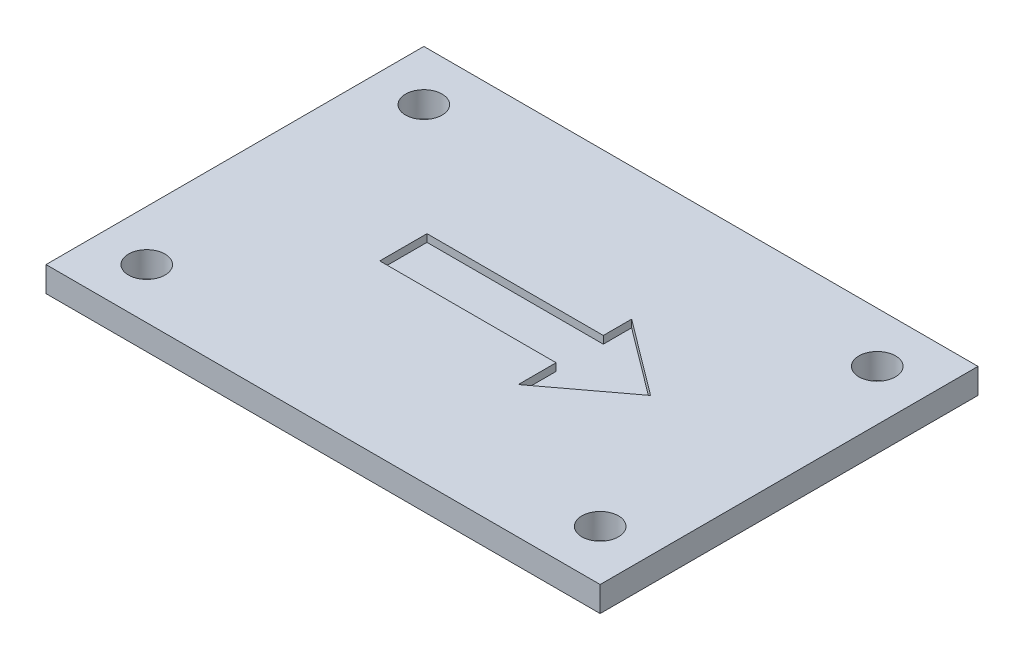
ISO-10303-21;
HEADER;
FILE_DESCRIPTION(('STEP AP214'),'2;1');
FILE_NAME('part.step','',(''),(''),'','','');
FILE_SCHEMA(('AUTOMOTIVE_DESIGN { 1 0 10303 214 1 1 1 1 }'));
ENDSEC;
DATA;
#1=APPLICATION_CONTEXT('core data for automotive mechanical design processes');
#2=APPLICATION_PROTOCOL_DEFINITION('international standard','automotive_design',2000,#1);
#3=PRODUCT_CONTEXT('',#1,'mechanical');
#4=PRODUCT('Part','Part','',(#3));
#5=PRODUCT_RELATED_PRODUCT_CATEGORY('part','',(#4));
#6=PRODUCT_DEFINITION_FORMATION('','',#4);
#7=PRODUCT_DEFINITION_CONTEXT('part definition',#1,'design');
#8=PRODUCT_DEFINITION('design','',#6,#7);
#9=PRODUCT_DEFINITION_SHAPE('','',#8);
#10=(LENGTH_UNIT() NAMED_UNIT(*) SI_UNIT(.MILLI.,.METRE.));
#11=(NAMED_UNIT(*) PLANE_ANGLE_UNIT() SI_UNIT($,.RADIAN.));
#12=(NAMED_UNIT(*) SI_UNIT($,.STERADIAN.) SOLID_ANGLE_UNIT());
#13=UNCERTAINTY_MEASURE_WITH_UNIT(LENGTH_MEASURE(1.E-05),#10,'distance_accuracy_value','');
#14=(GEOMETRIC_REPRESENTATION_CONTEXT(3) GLOBAL_UNCERTAINTY_ASSIGNED_CONTEXT((#13)) GLOBAL_UNIT_ASSIGNED_CONTEXT((#10,
#11,#12)) REPRESENTATION_CONTEXT('',''));
#15=CARTESIAN_POINT('',(0.,0.,0.));
#16=DIRECTION('',(0.,0.,1.));
#17=DIRECTION('',(1.,0.,0.));
#18=AXIS2_PLACEMENT_3D('',#15,#16,#17);
#19=CARTESIAN_POINT('',(22.,2.,15.));
#20=DIRECTION('',(-1.,0.,0.));
#21=DIRECTION('',(0.,0.,1.));
#22=AXIS2_PLACEMENT_3D('',#19,#20,#21);
#23=PLANE('',#22);
#24=DIRECTION('',(0.,0.,-1.));
#25=VECTOR('',#24,1.);
#26=CARTESIAN_POINT('',(22.,0.,15.));
#27=LINE('',#26,#25);
#28=CARTESIAN_POINT('',(22.,0.,15.));
#29=VERTEX_POINT('',#28);
#30=CARTESIAN_POINT('',(22.,0.,-15.));
#31=VERTEX_POINT('',#30);
#32=EDGE_CURVE('E264',#29,#31,#27,.T.);
#33=ORIENTED_EDGE('',*,*,#32,.T.);
#34=DIRECTION('',(0.,-1.,0.));
#35=VECTOR('',#34,1.);
#36=CARTESIAN_POINT('',(22.,2.,-15.));
#37=LINE('',#36,#35);
#38=CARTESIAN_POINT('',(22.,2.,-15.));
#39=VERTEX_POINT('',#38);
#40=EDGE_CURVE('E11',#39,#31,#37,.T.);
#41=ORIENTED_EDGE('',*,*,#40,.F.);
#42=DIRECTION('',(0.,0.,-1.));
#43=VECTOR('',#42,1.);
#44=CARTESIAN_POINT('',(22.,2.,15.));
#45=LINE('',#44,#43);
#46=CARTESIAN_POINT('',(22.,2.,15.));
#47=VERTEX_POINT('',#46);
#48=EDGE_CURVE('E253',#47,#39,#45,.T.);
#49=ORIENTED_EDGE('',*,*,#48,.F.);
#50=DIRECTION('',(0.,-1.,0.));
#51=VECTOR('',#50,1.);
#52=CARTESIAN_POINT('',(22.,2.,15.));
#53=LINE('',#52,#51);
#54=EDGE_CURVE('E263',#47,#29,#53,.T.);
#55=ORIENTED_EDGE('',*,*,#54,.T.);
#56=EDGE_LOOP('',(#33,#41,#49,#55));
#57=FACE_BOUND('',#56,.T.);
#58=ADVANCED_FACE('F39',(#57),#23,.F.);
#59=CARTESIAN_POINT('',(-22.,2.,-15.));
#60=DIRECTION('',(0.,0.,1.));
#61=DIRECTION('',(1.,0.,0.));
#62=AXIS2_PLACEMENT_3D('',#59,#60,#61);
#63=PLANE('',#62);
#64=DIRECTION('',(-1.,0.,0.));
#65=VECTOR('',#64,1.);
#66=CARTESIAN_POINT('',(-22.,0.,-15.));
#67=LINE('',#66,#65);
#68=CARTESIAN_POINT('',(-22.,0.,-15.));
#69=VERTEX_POINT('',#68);
#70=EDGE_CURVE('E267',#31,#69,#67,.T.);
#71=ORIENTED_EDGE('',*,*,#70,.T.);
#72=DIRECTION('',(0.,-1.,0.));
#73=VECTOR('',#72,1.);
#74=CARTESIAN_POINT('',(-22.,2.,-15.));
#75=LINE('',#74,#73);
#76=CARTESIAN_POINT('',(-22.,2.,-15.));
#77=VERTEX_POINT('',#76);
#78=EDGE_CURVE('E47',#77,#69,#75,.T.);
#79=ORIENTED_EDGE('',*,*,#78,.F.);
#80=DIRECTION('',(-1.,0.,0.));
#81=VECTOR('',#80,1.);
#82=CARTESIAN_POINT('',(-22.,2.,-15.));
#83=LINE('',#82,#81);
#84=EDGE_CURVE('E256',#39,#77,#83,.T.);
#85=ORIENTED_EDGE('',*,*,#84,.F.);
#86=ORIENTED_EDGE('',*,*,#40,.T.);
#87=EDGE_LOOP('',(#71,#79,#85,#86));
#88=FACE_BOUND('',#87,.T.);
#89=ADVANCED_FACE('F320',(#88),#63,.F.);
#90=CARTESIAN_POINT('',(-22.,2.,15.));
#91=DIRECTION('',(1.,0.,0.));
#92=DIRECTION('',(0.,0.,-1.));
#93=AXIS2_PLACEMENT_3D('',#90,#91,#92);
#94=PLANE('',#93);
#95=DIRECTION('',(0.,0.,1.));
#96=VECTOR('',#95,1.);
#97=CARTESIAN_POINT('',(-22.,0.,15.));
#98=LINE('',#97,#96);
#99=CARTESIAN_POINT('',(-22.,0.,15.));
#100=VERTEX_POINT('',#99);
#101=EDGE_CURVE('E269',#69,#100,#98,.T.);
#102=ORIENTED_EDGE('',*,*,#101,.T.);
#103=DIRECTION('',(0.,-1.,0.));
#104=VECTOR('',#103,1.);
#105=CARTESIAN_POINT('',(-22.,2.,15.));
#106=LINE('',#105,#104);
#107=CARTESIAN_POINT('',(-22.,2.,15.));
#108=VERTEX_POINT('',#107);
#109=EDGE_CURVE('E274',#108,#100,#106,.T.);
#110=ORIENTED_EDGE('',*,*,#109,.F.);
#111=DIRECTION('',(0.,0.,1.));
#112=VECTOR('',#111,1.);
#113=CARTESIAN_POINT('',(-22.,2.,15.));
#114=LINE('',#113,#112);
#115=EDGE_CURVE('E259',#77,#108,#114,.T.);
#116=ORIENTED_EDGE('',*,*,#115,.F.);
#117=ORIENTED_EDGE('',*,*,#78,.T.);
#118=EDGE_LOOP('',(#102,#110,#116,#117));
#119=FACE_BOUND('',#118,.T.);
#120=ADVANCED_FACE('F317',(#119),#94,.F.);
#121=CARTESIAN_POINT('',(-22.,2.,15.));
#122=DIRECTION('',(0.,0.,-1.));
#123=DIRECTION('',(-1.,0.,0.));
#124=AXIS2_PLACEMENT_3D('',#121,#122,#123);
#125=PLANE('',#124);
#126=DIRECTION('',(1.,0.,0.));
#127=VECTOR('',#126,1.);
#128=CARTESIAN_POINT('',(-22.,0.,15.));
#129=LINE('',#128,#127);
#130=EDGE_CURVE('E257',#100,#29,#129,.T.);
#131=ORIENTED_EDGE('',*,*,#130,.T.);
#132=ORIENTED_EDGE('',*,*,#54,.F.);
#133=DIRECTION('',(1.,0.,0.));
#134=VECTOR('',#133,1.);
#135=CARTESIAN_POINT('',(-22.,2.,15.));
#136=LINE('',#135,#134);
#137=EDGE_CURVE('E261',#108,#47,#136,.T.);
#138=ORIENTED_EDGE('',*,*,#137,.F.);
#139=ORIENTED_EDGE('',*,*,#109,.T.);
#140=EDGE_LOOP('',(#131,#132,#138,#139));
#141=FACE_BOUND('',#140,.T.);
#142=ADVANCED_FACE('F313',(#141),#125,.F.);
#143=CARTESIAN_POINT('',(0.,2.,0.));
#144=DIRECTION('',(0.,-1.,0.));
#145=DIRECTION('',(0.,0.,-1.));
#146=AXIS2_PLACEMENT_3D('',#143,#144,#145);
#147=PLANE('',#146);
#148=DIRECTION('',(1.,0.,0.));
#149=VECTOR('',#148,1.);
#150=CARTESIAN_POINT('',(-9.,2.,1.5));
#151=LINE('',#150,#149);
#152=CARTESIAN_POINT('',(-9.,2.,1.5));
#153=VERTEX_POINT('',#152);
#154=CARTESIAN_POINT('',(5.,2.,1.5));
#155=VERTEX_POINT('',#154);
#156=EDGE_CURVE('E209',#153,#155,#151,.T.);
#157=ORIENTED_EDGE('',*,*,#156,.F.);
#158=DIRECTION('',(0.,0.,1.));
#159=VECTOR('',#158,1.);
#160=CARTESIAN_POINT('',(-9.,2.,-2.25));
#161=LINE('',#160,#159);
#162=CARTESIAN_POINT('',(-9.,2.,-2.25));
#163=VERTEX_POINT('',#162);
#164=EDGE_CURVE('E181',#163,#153,#161,.T.);
#165=ORIENTED_EDGE('',*,*,#164,.F.);
#166=DIRECTION('',(-1.,0.,0.));
#167=VECTOR('',#166,1.);
#168=CARTESIAN_POINT('',(5.,2.,-2.25));
#169=LINE('',#168,#167);
#170=CARTESIAN_POINT('',(5.,2.,-2.25));
#171=VERTEX_POINT('',#170);
#172=EDGE_CURVE('E189',#171,#163,#169,.T.);
#173=ORIENTED_EDGE('',*,*,#172,.F.);
#174=DIRECTION('',(0.,0.,1.));
#175=VECTOR('',#174,1.);
#176=CARTESIAN_POINT('',(5.,2.,-4.5));
#177=LINE('',#176,#175);
#178=CARTESIAN_POINT('',(5.,2.,-4.5));
#179=VERTEX_POINT('',#178);
#180=EDGE_CURVE('E221',#179,#171,#177,.T.);
#181=ORIENTED_EDGE('',*,*,#180,.F.);
#182=DIRECTION('',(-0.8,0.,-0.6));
#183=VECTOR('',#182,1.);
#184=CARTESIAN_POINT('',(11.,2.,0.));
#185=LINE('',#184,#183);
#186=CARTESIAN_POINT('',(11.,2.,0.));
#187=VERTEX_POINT('',#186);
#188=EDGE_CURVE('E218',#187,#179,#185,.T.);
#189=ORIENTED_EDGE('',*,*,#188,.F.);
#190=DIRECTION('',(0.8,0.,-0.6));
#191=VECTOR('',#190,1.);
#192=CARTESIAN_POINT('',(5.,2.,4.5));
#193=LINE('',#192,#191);
#194=CARTESIAN_POINT('',(5.,2.,4.5));
#195=VERTEX_POINT('',#194);
#196=EDGE_CURVE('E215',#195,#187,#193,.T.);
#197=ORIENTED_EDGE('',*,*,#196,.F.);
#198=DIRECTION('',(0.,0.,1.));
#199=VECTOR('',#198,1.);
#200=CARTESIAN_POINT('',(5.,2.,1.5));
#201=LINE('',#200,#199);
#202=EDGE_CURVE('E212',#155,#195,#201,.T.);
#203=ORIENTED_EDGE('',*,*,#202,.F.);
#204=EDGE_LOOP('',(#157,#165,#173,#181,#189,#197,#203));
#205=FACE_BOUND('',#204,.T.);
#206=CARTESIAN_POINT('',(-18.,2.,-11.));
#207=DIRECTION('',(0.,1.,0.));
#208=DIRECTION('',(0.,0.,1.));
#209=AXIS2_PLACEMENT_3D('',#206,#207,#208);
#210=CIRCLE('',#209,1.45);
#211=CARTESIAN_POINT('',(-18.,2.,-9.55));
#212=VERTEX_POINT('',#211);
#213=EDGE_CURVE('E244',#212,#212,#210,.T.);
#214=ORIENTED_EDGE('',*,*,#213,.F.);
#215=EDGE_LOOP('',(#214));
#216=FACE_BOUND('',#215,.T.);
#217=CARTESIAN_POINT('',(18.,2.,11.));
#218=DIRECTION('',(0.,1.,0.));
#219=DIRECTION('',(0.,0.,1.));
#220=AXIS2_PLACEMENT_3D('',#217,#218,#219);
#221=CIRCLE('',#220,1.45);
#222=CARTESIAN_POINT('',(18.,2.,12.45));
#223=VERTEX_POINT('',#222);
#224=EDGE_CURVE('E243',#223,#223,#221,.T.);
#225=ORIENTED_EDGE('',*,*,#224,.F.);
#226=EDGE_LOOP('',(#225));
#227=FACE_BOUND('',#226,.T.);
#228=CARTESIAN_POINT('',(18.,2.,-11.));
#229=DIRECTION('',(0.,1.,0.));
#230=DIRECTION('',(0.,0.,1.));
#231=AXIS2_PLACEMENT_3D('',#228,#229,#230);
#232=CIRCLE('',#231,1.45);
#233=CARTESIAN_POINT('',(18.,2.,-9.55));
#234=VERTEX_POINT('',#233);
#235=EDGE_CURVE('E228',#234,#234,#232,.T.);
#236=ORIENTED_EDGE('',*,*,#235,.F.);
#237=EDGE_LOOP('',(#236));
#238=FACE_BOUND('',#237,.T.);
#239=CARTESIAN_POINT('',(-18.,2.,11.));
#240=DIRECTION('',(0.,1.,0.));
#241=DIRECTION('',(0.,0.,1.));
#242=AXIS2_PLACEMENT_3D('',#239,#240,#241);
#243=CIRCLE('',#242,1.45);
#244=CARTESIAN_POINT('',(-18.,2.,12.45));
#245=VERTEX_POINT('',#244);
#246=EDGE_CURVE('E247',#245,#245,#243,.T.);
#247=ORIENTED_EDGE('',*,*,#246,.F.);
#248=EDGE_LOOP('',(#247));
#249=FACE_BOUND('',#248,.T.);
#250=ORIENTED_EDGE('',*,*,#48,.T.);
#251=ORIENTED_EDGE('',*,*,#84,.T.);
#252=ORIENTED_EDGE('',*,*,#115,.T.);
#253=ORIENTED_EDGE('',*,*,#137,.T.);
#254=EDGE_LOOP('',(#250,#251,#252,#253));
#255=FACE_BOUND('',#254,.T.);
#256=ADVANCED_FACE('F297',(#205,#216,#227,#238,#249,#255),#147,.F.);
#257=CARTESIAN_POINT('',(0.,0.,0.));
#258=DIRECTION('',(0.,-1.,0.));
#259=DIRECTION('',(0.,0.,-1.));
#260=AXIS2_PLACEMENT_3D('',#257,#258,#259);
#261=PLANE('',#260);
#262=DIRECTION('',(0.,0.,1.));
#263=VECTOR('',#262,1.);
#264=CARTESIAN_POINT('',(-6.,0.,6.));
#265=LINE('',#264,#263);
#266=CARTESIAN_POINT('',(-6.,0.,6.));
#267=VERTEX_POINT('',#266);
#268=CARTESIAN_POINT('',(-6.,0.,8.));
#269=VERTEX_POINT('',#268);
#270=EDGE_CURVE('E176',#267,#269,#265,.T.);
#271=ORIENTED_EDGE('',*,*,#270,.T.);
#272=DIRECTION('',(1.,0.,0.));
#273=VECTOR('',#272,1.);
#274=CARTESIAN_POINT('',(-6.,0.,8.));
#275=LINE('',#274,#273);
#276=CARTESIAN_POINT('',(6.,0.,8.));
#277=VERTEX_POINT('',#276);
#278=EDGE_CURVE('E152',#269,#277,#275,.T.);
#279=ORIENTED_EDGE('',*,*,#278,.T.);
#280=DIRECTION('',(0.,0.,-1.));
#281=VECTOR('',#280,1.);
#282=CARTESIAN_POINT('',(6.,0.,6.));
#283=LINE('',#282,#281);
#284=CARTESIAN_POINT('',(6.,0.,6.));
#285=VERTEX_POINT('',#284);
#286=EDGE_CURVE('E60',#277,#285,#283,.T.);
#287=ORIENTED_EDGE('',*,*,#286,.T.);
#288=DIRECTION('',(-1.,0.,0.));
#289=VECTOR('',#288,1.);
#290=CARTESIAN_POINT('',(-6.,0.,6.));
#291=LINE('',#290,#289);
#292=EDGE_CURVE('E55',#285,#267,#291,.T.);
#293=ORIENTED_EDGE('',*,*,#292,.T.);
#294=EDGE_LOOP('',(#271,#279,#287,#293));
#295=FACE_BOUND('',#294,.T.);
#296=CARTESIAN_POINT('',(-18.,0.,-11.));
#297=DIRECTION('',(0.,-1.,0.));
#298=DIRECTION('',(0.,0.,-1.));
#299=AXIS2_PLACEMENT_3D('',#296,#297,#298);
#300=CIRCLE('',#299,1.45);
#301=CARTESIAN_POINT('',(-18.,0.,-12.45));
#302=VERTEX_POINT('',#301);
#303=EDGE_CURVE('E42',#302,#302,#300,.T.);
#304=ORIENTED_EDGE('',*,*,#303,.F.);
#305=EDGE_LOOP('',(#304));
#306=FACE_BOUND('',#305,.T.);
#307=CARTESIAN_POINT('',(18.,0.,11.));
#308=DIRECTION('',(0.,-1.,0.));
#309=DIRECTION('',(0.,0.,-1.));
#310=AXIS2_PLACEMENT_3D('',#307,#308,#309);
#311=CIRCLE('',#310,1.45);
#312=CARTESIAN_POINT('',(18.,0.,9.55));
#313=VERTEX_POINT('',#312);
#314=EDGE_CURVE('E283',#313,#313,#311,.T.);
#315=ORIENTED_EDGE('',*,*,#314,.F.);
#316=EDGE_LOOP('',(#315));
#317=FACE_BOUND('',#316,.T.);
#318=CARTESIAN_POINT('',(18.,0.,-11.));
#319=DIRECTION('',(0.,-1.,0.));
#320=DIRECTION('',(0.,0.,-1.));
#321=AXIS2_PLACEMENT_3D('',#318,#319,#320);
#322=CIRCLE('',#321,1.45);
#323=CARTESIAN_POINT('',(18.,0.,-12.45));
#324=VERTEX_POINT('',#323);
#325=EDGE_CURVE('E281',#324,#324,#322,.T.);
#326=ORIENTED_EDGE('',*,*,#325,.F.);
#327=EDGE_LOOP('',(#326));
#328=FACE_BOUND('',#327,.T.);
#329=CARTESIAN_POINT('',(-18.,0.,11.));
#330=DIRECTION('',(0.,-1.,0.));
#331=DIRECTION('',(0.,0.,-1.));
#332=AXIS2_PLACEMENT_3D('',#329,#330,#331);
#333=CIRCLE('',#332,1.45);
#334=CARTESIAN_POINT('',(-18.,0.,9.55));
#335=VERTEX_POINT('',#334);
#336=EDGE_CURVE('E252',#335,#335,#333,.T.);
#337=ORIENTED_EDGE('',*,*,#336,.F.);
#338=EDGE_LOOP('',(#337));
#339=FACE_BOUND('',#338,.T.);
#340=ORIENTED_EDGE('',*,*,#32,.F.);
#341=ORIENTED_EDGE('',*,*,#130,.F.);
#342=ORIENTED_EDGE('',*,*,#101,.F.);
#343=ORIENTED_EDGE('',*,*,#70,.F.);
#344=EDGE_LOOP('',(#340,#341,#342,#343));
#345=FACE_BOUND('',#344,.T.);
#346=ADVANCED_FACE('F293',(#295,#306,#317,#328,#339,#345),#261,.T.);
#347=CARTESIAN_POINT('',(-18.,-1.,11.));
#348=DIRECTION('',(0.,1.,0.));
#349=DIRECTION('',(0.,0.,1.));
#350=AXIS2_PLACEMENT_3D('',#347,#348,#349);
#351=CYLINDRICAL_SURFACE('',#350,1.45);
#352=ORIENTED_EDGE('',*,*,#336,.T.);
#353=EDGE_LOOP('',(#352));
#354=FACE_BOUND('',#353,.T.);
#355=ORIENTED_EDGE('',*,*,#246,.T.);
#356=EDGE_LOOP('',(#355));
#357=FACE_BOUND('',#356,.T.);
#358=ADVANCED_FACE('F296',(#354,#357),#351,.F.);
#359=CARTESIAN_POINT('',(18.,-1.,-11.));
#360=DIRECTION('',(0.,1.,0.));
#361=DIRECTION('',(0.,0.,1.));
#362=AXIS2_PLACEMENT_3D('',#359,#360,#361);
#363=CYLINDRICAL_SURFACE('',#362,1.45);
#364=ORIENTED_EDGE('',*,*,#325,.T.);
#365=EDGE_LOOP('',(#364));
#366=FACE_BOUND('',#365,.T.);
#367=ORIENTED_EDGE('',*,*,#235,.T.);
#368=EDGE_LOOP('',(#367));
#369=FACE_BOUND('',#368,.T.);
#370=ADVANCED_FACE('F356',(#366,#369),#363,.F.);
#371=CARTESIAN_POINT('',(18.,-1.,11.));
#372=DIRECTION('',(0.,1.,0.));
#373=DIRECTION('',(0.,0.,1.));
#374=AXIS2_PLACEMENT_3D('',#371,#372,#373);
#375=CYLINDRICAL_SURFACE('',#374,1.45);
#376=ORIENTED_EDGE('',*,*,#314,.T.);
#377=EDGE_LOOP('',(#376));
#378=FACE_BOUND('',#377,.T.);
#379=ORIENTED_EDGE('',*,*,#224,.T.);
#380=EDGE_LOOP('',(#379));
#381=FACE_BOUND('',#380,.T.);
#382=ADVANCED_FACE('F365',(#378,#381),#375,.F.);
#383=CARTESIAN_POINT('',(-18.,-1.,-11.));
#384=DIRECTION('',(0.,1.,0.));
#385=DIRECTION('',(0.,0.,1.));
#386=AXIS2_PLACEMENT_3D('',#383,#384,#385);
#387=CYLINDRICAL_SURFACE('',#386,1.45);
#388=ORIENTED_EDGE('',*,*,#303,.T.);
#389=EDGE_LOOP('',(#388));
#390=FACE_BOUND('',#389,.T.);
#391=ORIENTED_EDGE('',*,*,#213,.T.);
#392=EDGE_LOOP('',(#391));
#393=FACE_BOUND('',#392,.T.);
#394=ADVANCED_FACE('F290',(#390,#393),#387,.F.);
#395=CARTESIAN_POINT('',(-9.,1.4,-2.25));
#396=DIRECTION('',(-1.,0.,0.));
#397=DIRECTION('',(0.,0.,1.));
#398=AXIS2_PLACEMENT_3D('',#395,#396,#397);
#399=PLANE('',#398);
#400=ORIENTED_EDGE('',*,*,#164,.T.);
#401=DIRECTION('',(0.,1.,0.));
#402=VECTOR('',#401,1.);
#403=CARTESIAN_POINT('',(-9.,1.4,1.5));
#404=LINE('',#403,#402);
#405=CARTESIAN_POINT('',(-9.,1.4,1.5));
#406=VERTEX_POINT('',#405);
#407=EDGE_CURVE('E207',#406,#153,#404,.T.);
#408=ORIENTED_EDGE('',*,*,#407,.F.);
#409=DIRECTION('',(0.,0.,1.));
#410=VECTOR('',#409,1.);
#411=CARTESIAN_POINT('',(-9.,1.4,-2.25));
#412=LINE('',#411,#410);
#413=CARTESIAN_POINT('',(-9.,1.4,-2.25));
#414=VERTEX_POINT('',#413);
#415=EDGE_CURVE('E185',#414,#406,#412,.T.);
#416=ORIENTED_EDGE('',*,*,#415,.F.);
#417=DIRECTION('',(0.,1.,0.));
#418=VECTOR('',#417,1.);
#419=CARTESIAN_POINT('',(-9.,1.4,-2.25));
#420=LINE('',#419,#418);
#421=EDGE_CURVE('E226',#414,#163,#420,.T.);
#422=ORIENTED_EDGE('',*,*,#421,.T.);
#423=EDGE_LOOP('',(#400,#408,#416,#422));
#424=FACE_BOUND('',#423,.T.);
#425=ADVANCED_FACE('F379',(#424),#399,.F.);
#426=CARTESIAN_POINT('',(5.,1.4,-2.25));
#427=DIRECTION('',(0.,0.,-1.));
#428=DIRECTION('',(-1.,0.,0.));
#429=AXIS2_PLACEMENT_3D('',#426,#427,#428);
#430=PLANE('',#429);
#431=ORIENTED_EDGE('',*,*,#172,.T.);
#432=ORIENTED_EDGE('',*,*,#421,.F.);
#433=DIRECTION('',(-1.,0.,0.));
#434=VECTOR('',#433,1.);
#435=CARTESIAN_POINT('',(5.,1.4,-2.25));
#436=LINE('',#435,#434);
#437=CARTESIAN_POINT('',(5.,1.4,-2.25));
#438=VERTEX_POINT('',#437);
#439=EDGE_CURVE('E204',#438,#414,#436,.T.);
#440=ORIENTED_EDGE('',*,*,#439,.F.);
#441=DIRECTION('',(0.,1.,0.));
#442=VECTOR('',#441,1.);
#443=CARTESIAN_POINT('',(5.,1.4,-2.25));
#444=LINE('',#443,#442);
#445=EDGE_CURVE('E229',#438,#171,#444,.T.);
#446=ORIENTED_EDGE('',*,*,#445,.T.);
#447=EDGE_LOOP('',(#431,#432,#440,#446));
#448=FACE_BOUND('',#447,.T.);
#449=ADVANCED_FACE('F390',(#448),#430,.F.);
#450=CARTESIAN_POINT('',(5.,1.4,-4.5));
#451=DIRECTION('',(-1.,0.,0.));
#452=DIRECTION('',(0.,0.,1.));
#453=AXIS2_PLACEMENT_3D('',#450,#451,#452);
#454=PLANE('',#453);
#455=ORIENTED_EDGE('',*,*,#180,.T.);
#456=ORIENTED_EDGE('',*,*,#445,.F.);
#457=DIRECTION('',(0.,0.,1.));
#458=VECTOR('',#457,1.);
#459=CARTESIAN_POINT('',(5.,1.4,-4.5));
#460=LINE('',#459,#458);
#461=CARTESIAN_POINT('',(5.,1.4,-4.5));
#462=VERTEX_POINT('',#461);
#463=EDGE_CURVE('E201',#462,#438,#460,.T.);
#464=ORIENTED_EDGE('',*,*,#463,.F.);
#465=DIRECTION('',(0.,1.,0.));
#466=VECTOR('',#465,1.);
#467=CARTESIAN_POINT('',(5.,1.4,-4.5));
#468=LINE('',#467,#466);
#469=EDGE_CURVE('E231',#462,#179,#468,.T.);
#470=ORIENTED_EDGE('',*,*,#469,.T.);
#471=EDGE_LOOP('',(#455,#456,#464,#470));
#472=FACE_BOUND('',#471,.T.);
#473=ADVANCED_FACE('F400',(#472),#454,.F.);
#474=CARTESIAN_POINT('',(11.,1.4,0.));
#475=DIRECTION('',(0.6,0.,-0.8));
#476=DIRECTION('',(-0.8,0.,-0.6));
#477=AXIS2_PLACEMENT_3D('',#474,#475,#476);
#478=PLANE('',#477);
#479=ORIENTED_EDGE('',*,*,#188,.T.);
#480=ORIENTED_EDGE('',*,*,#469,.F.);
#481=DIRECTION('',(-0.8,0.,-0.6));
#482=VECTOR('',#481,1.);
#483=CARTESIAN_POINT('',(11.,1.4,0.));
#484=LINE('',#483,#482);
#485=CARTESIAN_POINT('',(11.,1.4,0.));
#486=VERTEX_POINT('',#485);
#487=EDGE_CURVE('E198',#486,#462,#484,.T.);
#488=ORIENTED_EDGE('',*,*,#487,.F.);
#489=DIRECTION('',(0.,1.,0.));
#490=VECTOR('',#489,1.);
#491=CARTESIAN_POINT('',(11.,1.4,0.));
#492=LINE('',#491,#490);
#493=EDGE_CURVE('E233',#486,#187,#492,.T.);
#494=ORIENTED_EDGE('',*,*,#493,.T.);
#495=EDGE_LOOP('',(#479,#480,#488,#494));
#496=FACE_BOUND('',#495,.T.);
#497=ADVANCED_FACE('F410',(#496),#478,.F.);
#498=CARTESIAN_POINT('',(5.,1.4,4.5));
#499=DIRECTION('',(0.6,0.,0.8));
#500=DIRECTION('',(0.8,0.,-0.6));
#501=AXIS2_PLACEMENT_3D('',#498,#499,#500);
#502=PLANE('',#501);
#503=ORIENTED_EDGE('',*,*,#196,.T.);
#504=ORIENTED_EDGE('',*,*,#493,.F.);
#505=DIRECTION('',(0.8,0.,-0.6));
#506=VECTOR('',#505,1.);
#507=CARTESIAN_POINT('',(5.,1.4,4.5));
#508=LINE('',#507,#506);
#509=CARTESIAN_POINT('',(5.,1.4,4.5));
#510=VERTEX_POINT('',#509);
#511=EDGE_CURVE('E195',#510,#486,#508,.T.);
#512=ORIENTED_EDGE('',*,*,#511,.F.);
#513=DIRECTION('',(0.,1.,0.));
#514=VECTOR('',#513,1.);
#515=CARTESIAN_POINT('',(5.,1.4,4.5));
#516=LINE('',#515,#514);
#517=EDGE_CURVE('E235',#510,#195,#516,.T.);
#518=ORIENTED_EDGE('',*,*,#517,.T.);
#519=EDGE_LOOP('',(#503,#504,#512,#518));
#520=FACE_BOUND('',#519,.T.);
#521=ADVANCED_FACE('F420',(#520),#502,.F.);
#522=CARTESIAN_POINT('',(5.,1.4,1.5));
#523=DIRECTION('',(-1.,0.,0.));
#524=DIRECTION('',(0.,0.,1.));
#525=AXIS2_PLACEMENT_3D('',#522,#523,#524);
#526=PLANE('',#525);
#527=ORIENTED_EDGE('',*,*,#202,.T.);
#528=ORIENTED_EDGE('',*,*,#517,.F.);
#529=DIRECTION('',(0.,0.,1.));
#530=VECTOR('',#529,1.);
#531=CARTESIAN_POINT('',(5.,1.4,1.5));
#532=LINE('',#531,#530);
#533=CARTESIAN_POINT('',(5.,1.4,1.5));
#534=VERTEX_POINT('',#533);
#535=EDGE_CURVE('E192',#534,#510,#532,.T.);
#536=ORIENTED_EDGE('',*,*,#535,.F.);
#537=DIRECTION('',(0.,1.,0.));
#538=VECTOR('',#537,1.);
#539=CARTESIAN_POINT('',(5.,1.4,1.5));
#540=LINE('',#539,#538);
#541=EDGE_CURVE('E237',#534,#155,#540,.T.);
#542=ORIENTED_EDGE('',*,*,#541,.T.);
#543=EDGE_LOOP('',(#527,#528,#536,#542));
#544=FACE_BOUND('',#543,.T.);
#545=ADVANCED_FACE('F430',(#544),#526,.F.);
#546=CARTESIAN_POINT('',(-9.,1.4,1.5));
#547=DIRECTION('',(0.,0.,1.));
#548=DIRECTION('',(1.,0.,0.));
#549=AXIS2_PLACEMENT_3D('',#546,#547,#548);
#550=PLANE('',#549);
#551=ORIENTED_EDGE('',*,*,#156,.T.);
#552=ORIENTED_EDGE('',*,*,#541,.F.);
#553=DIRECTION('',(1.,0.,0.));
#554=VECTOR('',#553,1.);
#555=CARTESIAN_POINT('',(-9.,1.4,1.5));
#556=LINE('',#555,#554);
#557=EDGE_CURVE('E188',#406,#534,#556,.T.);
#558=ORIENTED_EDGE('',*,*,#557,.F.);
#559=ORIENTED_EDGE('',*,*,#407,.T.);
#560=EDGE_LOOP('',(#551,#552,#558,#559));
#561=FACE_BOUND('',#560,.T.);
#562=ADVANCED_FACE('F440',(#561),#550,.F.);
#563=CARTESIAN_POINT('',(0.,1.4,0.));
#564=DIRECTION('',(0.,1.,0.));
#565=DIRECTION('',(0.,0.,1.));
#566=AXIS2_PLACEMENT_3D('',#563,#564,#565);
#567=PLANE('',#566);
#568=ORIENTED_EDGE('',*,*,#415,.T.);
#569=ORIENTED_EDGE('',*,*,#557,.T.);
#570=ORIENTED_EDGE('',*,*,#535,.T.);
#571=ORIENTED_EDGE('',*,*,#511,.T.);
#572=ORIENTED_EDGE('',*,*,#487,.T.);
#573=ORIENTED_EDGE('',*,*,#463,.T.);
#574=ORIENTED_EDGE('',*,*,#439,.T.);
#575=EDGE_LOOP('',(#568,#569,#570,#571,#572,#573,#574));
#576=FACE_BOUND('',#575,.T.);
#577=ADVANCED_FACE('F450',(#576),#567,.T.);
#578=CARTESIAN_POINT('',(-6.,-2.4,6.));
#579=DIRECTION('',(-1.,0.,0.));
#580=DIRECTION('',(0.,0.,1.));
#581=AXIS2_PLACEMENT_3D('',#578,#579,#580);
#582=PLANE('',#581);
#583=ORIENTED_EDGE('',*,*,#270,.F.);
#584=DIRECTION('',(0.,1.,0.));
#585=VECTOR('',#584,1.);
#586=CARTESIAN_POINT('',(-6.,-2.4,6.));
#587=LINE('',#586,#585);
#588=CARTESIAN_POINT('',(-6.,-2.4,6.));
#589=VERTEX_POINT('',#588);
#590=EDGE_CURVE('E170',#589,#267,#587,.T.);
#591=ORIENTED_EDGE('',*,*,#590,.F.);
#592=DIRECTION('',(0.,0.,1.));
#593=VECTOR('',#592,1.);
#594=CARTESIAN_POINT('',(-6.,-2.4,6.));
#595=LINE('',#594,#593);
#596=CARTESIAN_POINT('',(-6.,-2.4,8.));
#597=VERTEX_POINT('',#596);
#598=EDGE_CURVE('E164',#589,#597,#595,.T.);
#599=ORIENTED_EDGE('',*,*,#598,.T.);
#600=DIRECTION('',(0.,1.,0.));
#601=VECTOR('',#600,1.);
#602=CARTESIAN_POINT('',(-6.,-2.4,8.));
#603=LINE('',#602,#601);
#604=EDGE_CURVE('E147',#597,#269,#603,.T.);
#605=ORIENTED_EDGE('',*,*,#604,.T.);
#606=EDGE_LOOP('',(#583,#591,#599,#605));
#607=FACE_BOUND('',#606,.T.);
#608=ADVANCED_FACE('F169',(#607),#582,.T.);
#609=CARTESIAN_POINT('',(-6.,-2.4,6.));
#610=DIRECTION('',(0.,0.,-1.));
#611=DIRECTION('',(-1.,0.,0.));
#612=AXIS2_PLACEMENT_3D('',#609,#610,#611);
#613=PLANE('',#612);
#614=ORIENTED_EDGE('',*,*,#292,.F.);
#615=DIRECTION('',(0.,1.,0.));
#616=VECTOR('',#615,1.);
#617=CARTESIAN_POINT('',(6.,-2.4,6.));
#618=LINE('',#617,#616);
#619=CARTESIAN_POINT('',(6.,-2.4,6.));
#620=VERTEX_POINT('',#619);
#621=EDGE_CURVE('E182',#620,#285,#618,.T.);
#622=ORIENTED_EDGE('',*,*,#621,.F.);
#623=DIRECTION('',(-1.,0.,0.));
#624=VECTOR('',#623,1.);
#625=CARTESIAN_POINT('',(-6.,-2.4,6.));
#626=LINE('',#625,#624);
#627=EDGE_CURVE('E157',#620,#589,#626,.T.);
#628=ORIENTED_EDGE('',*,*,#627,.T.);
#629=ORIENTED_EDGE('',*,*,#590,.T.);
#630=EDGE_LOOP('',(#614,#622,#628,#629));
#631=FACE_BOUND('',#630,.T.);
#632=ADVANCED_FACE('F469',(#631),#613,.T.);
#633=CARTESIAN_POINT('',(6.,-2.4,6.));
#634=DIRECTION('',(1.,0.,0.));
#635=DIRECTION('',(0.,0.,-1.));
#636=AXIS2_PLACEMENT_3D('',#633,#634,#635);
#637=PLANE('',#636);
#638=ORIENTED_EDGE('',*,*,#286,.F.);
#639=DIRECTION('',(0.,1.,0.));
#640=VECTOR('',#639,1.);
#641=CARTESIAN_POINT('',(6.,-2.4,8.));
#642=LINE('',#641,#640);
#643=CARTESIAN_POINT('',(6.,-2.4,8.));
#644=VERTEX_POINT('',#643);
#645=EDGE_CURVE('E156',#644,#277,#642,.T.);
#646=ORIENTED_EDGE('',*,*,#645,.F.);
#647=DIRECTION('',(0.,0.,-1.));
#648=VECTOR('',#647,1.);
#649=CARTESIAN_POINT('',(6.,-2.4,6.));
#650=LINE('',#649,#648);
#651=EDGE_CURVE('E167',#644,#620,#650,.T.);
#652=ORIENTED_EDGE('',*,*,#651,.T.);
#653=ORIENTED_EDGE('',*,*,#621,.T.);
#654=EDGE_LOOP('',(#638,#646,#652,#653));
#655=FACE_BOUND('',#654,.T.);
#656=ADVANCED_FACE('F478',(#655),#637,.T.);
#657=CARTESIAN_POINT('',(-6.,-2.4,8.));
#658=DIRECTION('',(0.,0.,1.));
#659=DIRECTION('',(1.,0.,0.));
#660=AXIS2_PLACEMENT_3D('',#657,#658,#659);
#661=PLANE('',#660);
#662=ORIENTED_EDGE('',*,*,#278,.F.);
#663=ORIENTED_EDGE('',*,*,#604,.F.);
#664=DIRECTION('',(1.,0.,0.));
#665=VECTOR('',#664,1.);
#666=CARTESIAN_POINT('',(-6.,-2.4,8.));
#667=LINE('',#666,#665);
#668=EDGE_CURVE('E151',#597,#644,#667,.T.);
#669=ORIENTED_EDGE('',*,*,#668,.T.);
#670=ORIENTED_EDGE('',*,*,#645,.T.);
#671=EDGE_LOOP('',(#662,#663,#669,#670));
#672=FACE_BOUND('',#671,.T.);
#673=ADVANCED_FACE('F149',(#672),#661,.T.);
#674=CARTESIAN_POINT('',(0.,-2.4,0.));
#675=DIRECTION('',(0.,1.,0.));
#676=DIRECTION('',(0.,0.,1.));
#677=AXIS2_PLACEMENT_3D('',#674,#675,#676);
#678=PLANE('',#677);
#679=ORIENTED_EDGE('',*,*,#598,.F.);
#680=ORIENTED_EDGE('',*,*,#627,.F.);
#681=ORIENTED_EDGE('',*,*,#651,.F.);
#682=ORIENTED_EDGE('',*,*,#668,.F.);
#683=EDGE_LOOP('',(#679,#680,#681,#682));
#684=FACE_BOUND('',#683,.T.);
#685=ADVANCED_FACE('F162',(#684),#678,.F.);
#686=CLOSED_SHELL('',(#58,#89,#120,#142,#256,#346,#358,#370,#382,#394,#425,#449,#473,#497,#521,
#545,#562,#577,#608,#632,#656,#673,#685));
#687=MANIFOLD_SOLID_BREP('B2',#686);
#688=ADVANCED_BREP_SHAPE_REPRESENTATION('',(#18,#687),#14);
#689=SHAPE_DEFINITION_REPRESENTATION(#9,#688);
ENDSEC;
END-ISO-10303-21;
